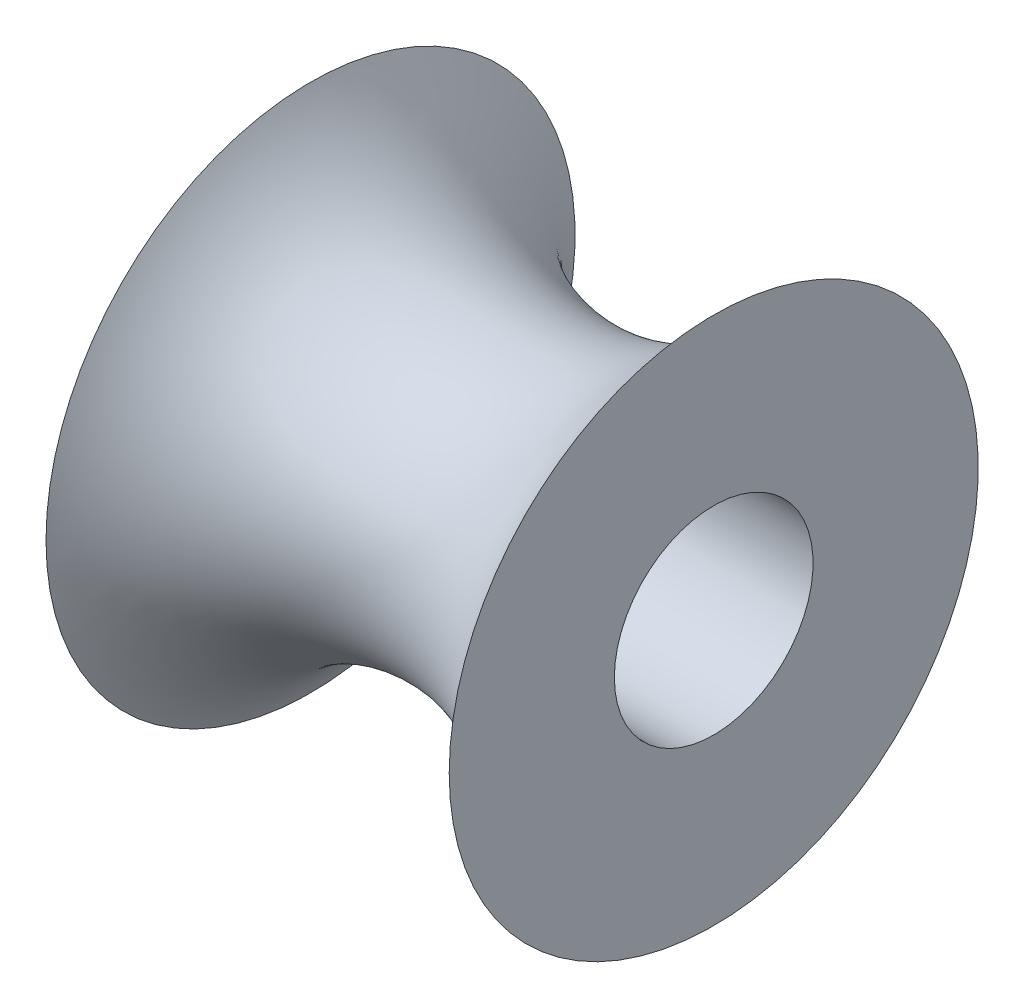
ISO-10303-21;
HEADER;
FILE_DESCRIPTION(('STEP AP214'),'2;1');
FILE_NAME('part.step','',(''),(''),'','','');
FILE_SCHEMA(('AUTOMOTIVE_DESIGN { 1 0 10303 214 1 1 1 1 }'));
ENDSEC;
DATA;
#1=APPLICATION_CONTEXT('core data for automotive mechanical design processes');
#2=APPLICATION_PROTOCOL_DEFINITION('international standard','automotive_design',2000,#1);
#3=PRODUCT_CONTEXT('',#1,'mechanical');
#4=PRODUCT('Part','Part','',(#3));
#5=PRODUCT_RELATED_PRODUCT_CATEGORY('part','',(#4));
#6=PRODUCT_DEFINITION_FORMATION('','',#4);
#7=PRODUCT_DEFINITION_CONTEXT('part definition',#1,'design');
#8=PRODUCT_DEFINITION('design','',#6,#7);
#9=PRODUCT_DEFINITION_SHAPE('','',#8);
#10=(LENGTH_UNIT() NAMED_UNIT(*) SI_UNIT(.MILLI.,.METRE.));
#11=(NAMED_UNIT(*) PLANE_ANGLE_UNIT() SI_UNIT($,.RADIAN.));
#12=(NAMED_UNIT(*) SI_UNIT($,.STERADIAN.) SOLID_ANGLE_UNIT());
#13=UNCERTAINTY_MEASURE_WITH_UNIT(LENGTH_MEASURE(1.E-05),#10,'distance_accuracy_value','');
#14=(GEOMETRIC_REPRESENTATION_CONTEXT(3) GLOBAL_UNCERTAINTY_ASSIGNED_CONTEXT((#13)) GLOBAL_UNIT_ASSIGNED_CONTEXT((#10,
#11,#12)) REPRESENTATION_CONTEXT('',''));
#15=CARTESIAN_POINT('',(0.,0.,0.));
#16=DIRECTION('',(0.,0.,1.));
#17=DIRECTION('',(1.,0.,0.));
#18=AXIS2_PLACEMENT_3D('',#15,#16,#17);
#19=CARTESIAN_POINT('',(4.69341937279921,0.,0.));
#20=DIRECTION('',(-1.,0.,0.));
#21=DIRECTION('',(0.,0.,1.));
#22=AXIS2_PLACEMENT_3D('',#19,#20,#21);
#23=PLANE('',#22);
#24=CARTESIAN_POINT('',(4.69341937279921,0.,0.));
#25=DIRECTION('',(-1.,0.,0.));
#26=DIRECTION('',(0.,0.,1.));
#27=AXIS2_PLACEMENT_3D('',#24,#25,#26);
#28=CIRCLE('',#27,6.12339944392203);
#29=CARTESIAN_POINT('',(4.69341937279921,0.,6.12339944392203));
#30=VERTEX_POINT('',#29);
#31=EDGE_CURVE('E10',#30,#30,#28,.T.);
#32=ORIENTED_EDGE('',*,*,#31,.F.);
#33=EDGE_LOOP('',(#32));
#34=FACE_BOUND('',#33,.T.);
#35=CARTESIAN_POINT('',(4.69341937279921,0.,0.));
#36=DIRECTION('',(-1.,0.,0.));
#37=DIRECTION('',(0.,0.,1.));
#38=AXIS2_PLACEMENT_3D('',#35,#36,#37);
#39=CIRCLE('',#38,2.3);
#40=CARTESIAN_POINT('',(4.69341937279921,0.,2.3));
#41=VERTEX_POINT('',#40);
#42=EDGE_CURVE('E47',#41,#41,#39,.T.);
#43=ORIENTED_EDGE('',*,*,#42,.T.);
#44=EDGE_LOOP('',(#43));
#45=FACE_BOUND('',#44,.T.);
#46=ADVANCED_FACE('F33',(#34,#45),#23,.F.);
#47=CARTESIAN_POINT('',(0.0267527061325453,0.,0.));
#48=DIRECTION('',(-1.,0.,0.));
#49=DIRECTION('',(0.,0.,1.));
#50=AXIS2_PLACEMENT_3D('',#47,#48,#49);
#51=TOROIDAL_SURFACE('',#50,8.71058126017428,5.33584927899243);
#52=CARTESIAN_POINT('',(-4.63991396053412,0.,0.));
#53=DIRECTION('',(-1.,0.,0.));
#54=DIRECTION('',(0.,0.,1.));
#55=AXIS2_PLACEMENT_3D('',#52,#53,#54);
#56=CIRCLE('',#55,6.12339944392203);
#57=CARTESIAN_POINT('',(-4.63991396053412,0.,6.12339944392203));
#58=VERTEX_POINT('',#57);
#59=EDGE_CURVE('E39',#58,#58,#56,.T.);
#60=ORIENTED_EDGE('',*,*,#59,.F.);
#61=EDGE_LOOP('',(#60));
#62=FACE_BOUND('',#61,.T.);
#63=ORIENTED_EDGE('',*,*,#31,.T.);
#64=EDGE_LOOP('',(#63));
#65=FACE_BOUND('',#64,.T.);
#66=ADVANCED_FACE('F62',(#62,#65),#51,.F.);
#67=CARTESIAN_POINT('',(-4.63991396053412,0.,0.));
#68=DIRECTION('',(-1.,0.,0.));
#69=DIRECTION('',(0.,0.,1.));
#70=AXIS2_PLACEMENT_3D('',#67,#68,#69);
#71=PLANE('',#70);
#72=ORIENTED_EDGE('',*,*,#59,.T.);
#73=EDGE_LOOP('',(#72));
#74=FACE_BOUND('',#73,.T.);
#75=CARTESIAN_POINT('',(-4.63991396053412,0.,0.));
#76=DIRECTION('',(-1.,0.,0.));
#77=DIRECTION('',(0.,0.,1.));
#78=AXIS2_PLACEMENT_3D('',#75,#76,#77);
#79=CIRCLE('',#78,2.3);
#80=CARTESIAN_POINT('',(-4.63991396053412,0.,2.3));
#81=VERTEX_POINT('',#80);
#82=EDGE_CURVE('E43',#81,#81,#79,.T.);
#83=ORIENTED_EDGE('',*,*,#82,.F.);
#84=EDGE_LOOP('',(#83));
#85=FACE_BOUND('',#84,.T.);
#86=ADVANCED_FACE('F57',(#74,#85),#71,.T.);
#87=CARTESIAN_POINT('',(-4.63991396053412,0.,0.));
#88=DIRECTION('',(-1.,0.,0.));
#89=DIRECTION('',(0.,0.,1.));
#90=AXIS2_PLACEMENT_3D('',#87,#88,#89);
#91=CYLINDRICAL_SURFACE('',#90,2.3);
#92=ORIENTED_EDGE('',*,*,#42,.F.);
#93=EDGE_LOOP('',(#92));
#94=FACE_BOUND('',#93,.T.);
#95=ORIENTED_EDGE('',*,*,#82,.T.);
#96=EDGE_LOOP('',(#95));
#97=FACE_BOUND('',#96,.T.);
#98=ADVANCED_FACE('F54',(#94,#97),#91,.F.);
#99=CLOSED_SHELL('',(#46,#66,#86,#98));
#100=MANIFOLD_SOLID_BREP('B2',#99);
#101=ADVANCED_BREP_SHAPE_REPRESENTATION('',(#18,#100),#14);
#102=SHAPE_DEFINITION_REPRESENTATION(#9,#101);
ENDSEC;
END-ISO-10303-21;
